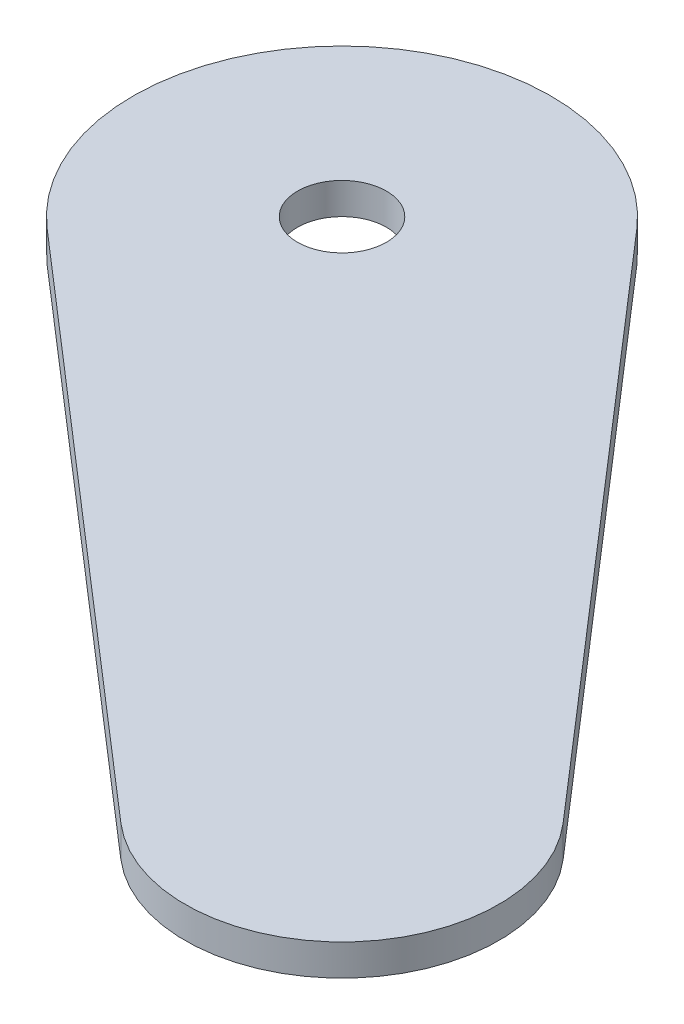
ISO-10303-21;
HEADER;
FILE_DESCRIPTION(('STEP AP214'),'2;1');
FILE_NAME('part.step','',(''),(''),'','','');
FILE_SCHEMA(('AUTOMOTIVE_DESIGN { 1 0 10303 214 1 1 1 1 }'));
ENDSEC;
DATA;
#1=APPLICATION_CONTEXT('core data for automotive mechanical design processes');
#2=APPLICATION_PROTOCOL_DEFINITION('international standard','automotive_design',2000,#1);
#3=PRODUCT_CONTEXT('',#1,'mechanical');
#4=PRODUCT('Part','Part','',(#3));
#5=PRODUCT_RELATED_PRODUCT_CATEGORY('part','',(#4));
#6=PRODUCT_DEFINITION_FORMATION('','',#4);
#7=PRODUCT_DEFINITION_CONTEXT('part definition',#1,'design');
#8=PRODUCT_DEFINITION('design','',#6,#7);
#9=PRODUCT_DEFINITION_SHAPE('','',#8);
#10=(LENGTH_UNIT() NAMED_UNIT(*) SI_UNIT(.MILLI.,.METRE.));
#11=(NAMED_UNIT(*) PLANE_ANGLE_UNIT() SI_UNIT($,.RADIAN.));
#12=(NAMED_UNIT(*) SI_UNIT($,.STERADIAN.) SOLID_ANGLE_UNIT());
#13=UNCERTAINTY_MEASURE_WITH_UNIT(LENGTH_MEASURE(1.E-05),#10,'distance_accuracy_value','');
#14=(GEOMETRIC_REPRESENTATION_CONTEXT(3) GLOBAL_UNCERTAINTY_ASSIGNED_CONTEXT((#13)) GLOBAL_UNIT_ASSIGNED_CONTEXT((#10,
#11,#12)) REPRESENTATION_CONTEXT('',''));
#15=CARTESIAN_POINT('',(0.,0.,0.));
#16=DIRECTION('',(0.,0.,1.));
#17=DIRECTION('',(1.,0.,0.));
#18=AXIS2_PLACEMENT_3D('',#15,#16,#17);
#19=CARTESIAN_POINT('',(0.,3.,0.));
#20=DIRECTION('',(0.,-1.,0.));
#21=DIRECTION('',(0.,0.,-1.));
#22=AXIS2_PLACEMENT_3D('',#19,#20,#21);
#23=CYLINDRICAL_SURFACE('',#22,20.);
#24=CARTESIAN_POINT('',(0.,0.,0.));
#25=DIRECTION('',(0.,1.,0.));
#26=DIRECTION('',(0.,0.,1.));
#27=AXIS2_PLACEMENT_3D('',#24,#25,#26);
#28=CIRCLE('',#27,20.);
#29=CARTESIAN_POINT('',(15.1161651575033,0.,-13.0958600683989));
#30=VERTEX_POINT('',#29);
#31=CARTESIAN_POINT('',(-13.0958600683989,0.,15.1161651575033));
#32=VERTEX_POINT('',#31);
#33=EDGE_CURVE('E116',#30,#32,#28,.T.);
#34=ORIENTED_EDGE('',*,*,#33,.T.);
#35=DIRECTION('',(0.,-1.,0.));
#36=VECTOR('',#35,1.);
#37=CARTESIAN_POINT('',(-13.0958600683989,3.,15.1161651575033));
#38=LINE('',#37,#36);
#39=CARTESIAN_POINT('',(-13.0958600683989,3.,15.1161651575033));
#40=VERTEX_POINT('',#39);
#41=EDGE_CURVE('E11',#40,#32,#38,.T.);
#42=ORIENTED_EDGE('',*,*,#41,.F.);
#43=CARTESIAN_POINT('',(0.,3.,0.));
#44=DIRECTION('',(0.,1.,0.));
#45=DIRECTION('',(0.,0.,1.));
#46=AXIS2_PLACEMENT_3D('',#43,#44,#45);
#47=CIRCLE('',#46,20.);
#48=CARTESIAN_POINT('',(15.1161651575033,3.,-13.0958600683989));
#49=VERTEX_POINT('',#48);
#50=EDGE_CURVE('E98',#49,#40,#47,.T.);
#51=ORIENTED_EDGE('',*,*,#50,.F.);
#52=DIRECTION('',(0.,-1.,0.));
#53=VECTOR('',#52,1.);
#54=CARTESIAN_POINT('',(15.1161651575033,3.,-13.0958600683989));
#55=LINE('',#54,#53);
#56=EDGE_CURVE('E64',#49,#30,#55,.T.);
#57=ORIENTED_EDGE('',*,*,#56,.T.);
#58=EDGE_LOOP('',(#34,#42,#51,#57));
#59=FACE_BOUND('',#58,.T.);
#60=ADVANCED_FACE('F47',(#59),#23,.T.);
#61=CARTESIAN_POINT('',(-13.0958600683989,3.,15.1161651575033));
#62=DIRECTION('',(0.654793003419943,0.,-0.755808257875164));
#63=DIRECTION('',(-0.755808257875164,0.,-0.654793003419943));
#64=AXIS2_PLACEMENT_3D('',#61,#62,#63);
#65=PLANE('',#64);
#66=DIRECTION('',(0.755808257875164,0.,0.654793003419943));
#67=VECTOR('',#66,1.);
#68=CARTESIAN_POINT('',(-13.0958600683989,0.,15.1161651575033));
#69=LINE('',#68,#67);
#70=CARTESIAN_POINT('',(39.6755796317592,0.,60.8345985511858));
#71=VERTEX_POINT('',#70);
#72=EDGE_CURVE('E104',#32,#71,#69,.T.);
#73=ORIENTED_EDGE('',*,*,#72,.T.);
#74=DIRECTION('',(0.,-1.,0.));
#75=VECTOR('',#74,1.);
#76=CARTESIAN_POINT('',(39.6755796317592,3.,60.8345985511858));
#77=LINE('',#76,#75);
#78=CARTESIAN_POINT('',(39.6755796317592,3.,60.8345985511858));
#79=VERTEX_POINT('',#78);
#80=EDGE_CURVE('E56',#79,#71,#77,.T.);
#81=ORIENTED_EDGE('',*,*,#80,.F.);
#82=DIRECTION('',(0.755808257875164,0.,0.654793003419943));
#83=VECTOR('',#82,1.);
#84=CARTESIAN_POINT('',(-13.0958600683989,3.,15.1161651575033));
#85=LINE('',#84,#83);
#86=EDGE_CURVE('E90',#40,#79,#85,.T.);
#87=ORIENTED_EDGE('',*,*,#86,.F.);
#88=ORIENTED_EDGE('',*,*,#41,.T.);
#89=EDGE_LOOP('',(#73,#81,#87,#88));
#90=FACE_BOUND('',#89,.T.);
#91=ADVANCED_FACE('F103',(#90),#65,.F.);
#92=CARTESIAN_POINT('',(49.4974746830583,3.,49.4974746830583));
#93=DIRECTION('',(0.,-1.,0.));
#94=DIRECTION('',(0.,0.,-1.));
#95=AXIS2_PLACEMENT_3D('',#92,#93,#94);
#96=CYLINDRICAL_SURFACE('',#95,15.);
#97=CARTESIAN_POINT('',(49.4974746830583,0.,49.4974746830583));
#98=DIRECTION('',(0.,1.,0.));
#99=DIRECTION('',(0.,0.,1.));
#100=AXIS2_PLACEMENT_3D('',#97,#98,#99);
#101=CIRCLE('',#100,15.);
#102=CARTESIAN_POINT('',(60.8345985511858,0.,39.6755796317592));
#103=VERTEX_POINT('',#102);
#104=EDGE_CURVE('E122',#71,#103,#101,.T.);
#105=ORIENTED_EDGE('',*,*,#104,.T.);
#106=DIRECTION('',(0.,-1.,0.));
#107=VECTOR('',#106,1.);
#108=CARTESIAN_POINT('',(60.8345985511858,3.,39.6755796317592));
#109=LINE('',#108,#107);
#110=CARTESIAN_POINT('',(60.8345985511858,3.,39.6755796317592));
#111=VERTEX_POINT('',#110);
#112=EDGE_CURVE('E79',#111,#103,#109,.T.);
#113=ORIENTED_EDGE('',*,*,#112,.F.);
#114=CARTESIAN_POINT('',(49.4974746830583,3.,49.4974746830583));
#115=DIRECTION('',(0.,1.,0.));
#116=DIRECTION('',(0.,0.,1.));
#117=AXIS2_PLACEMENT_3D('',#114,#115,#116);
#118=CIRCLE('',#117,15.);
#119=EDGE_CURVE('E97',#79,#111,#118,.T.);
#120=ORIENTED_EDGE('',*,*,#119,.F.);
#121=ORIENTED_EDGE('',*,*,#80,.T.);
#122=EDGE_LOOP('',(#105,#113,#120,#121));
#123=FACE_BOUND('',#122,.T.);
#124=ADVANCED_FACE('F108',(#123),#96,.T.);
#125=CARTESIAN_POINT('',(15.1161651575033,3.,-13.0958600683989));
#126=DIRECTION('',(0.755808257875164,0.,-0.654793003419943));
#127=DIRECTION('',(-0.654793003419943,0.,-0.755808257875164));
#128=AXIS2_PLACEMENT_3D('',#125,#126,#127);
#129=PLANE('',#128);
#130=DIRECTION('',(0.654793003419943,0.,0.755808257875164));
#131=VECTOR('',#130,1.);
#132=CARTESIAN_POINT('',(15.1161651575033,0.,-13.0958600683989));
#133=LINE('',#132,#131);
#134=EDGE_CURVE('E125',#30,#103,#133,.T.);
#135=ORIENTED_EDGE('',*,*,#134,.F.);
#136=ORIENTED_EDGE('',*,*,#56,.F.);
#137=DIRECTION('',(0.654793003419943,0.,0.755808257875164));
#138=VECTOR('',#137,1.);
#139=CARTESIAN_POINT('',(15.1161651575033,3.,-13.0958600683989));
#140=LINE('',#139,#138);
#141=EDGE_CURVE('E110',#49,#111,#140,.T.);
#142=ORIENTED_EDGE('',*,*,#141,.T.);
#143=ORIENTED_EDGE('',*,*,#112,.T.);
#144=EDGE_LOOP('',(#135,#136,#142,#143));
#145=FACE_BOUND('',#144,.T.);
#146=ADVANCED_FACE('F151',(#145),#129,.T.);
#147=CARTESIAN_POINT('',(0.,3.,0.));
#148=DIRECTION('',(0.,1.,0.));
#149=DIRECTION('',(0.,0.,1.));
#150=AXIS2_PLACEMENT_3D('',#147,#148,#149);
#151=PLANE('',#150);
#152=ORIENTED_EDGE('',*,*,#50,.T.);
#153=ORIENTED_EDGE('',*,*,#86,.T.);
#154=ORIENTED_EDGE('',*,*,#119,.T.);
#155=ORIENTED_EDGE('',*,*,#141,.F.);
#156=EDGE_LOOP('',(#152,#153,#154,#155));
#157=FACE_BOUND('',#156,.T.);
#158=CARTESIAN_POINT('',(0.,3.,0.));
#159=DIRECTION('',(0.,1.,0.));
#160=DIRECTION('',(0.,0.,1.));
#161=AXIS2_PLACEMENT_3D('',#158,#159,#160);
#162=CIRCLE('',#161,4.25);
#163=CARTESIAN_POINT('',(0.,3.,4.25));
#164=VERTEX_POINT('',#163);
#165=EDGE_CURVE('E135',#164,#164,#162,.T.);
#166=ORIENTED_EDGE('',*,*,#165,.F.);
#167=EDGE_LOOP('',(#166));
#168=FACE_BOUND('',#167,.T.);
#169=ADVANCED_FACE('F93',(#157,#168),#151,.T.);
#170=CARTESIAN_POINT('',(0.,0.,0.));
#171=DIRECTION('',(0.,1.,0.));
#172=DIRECTION('',(0.,0.,1.));
#173=AXIS2_PLACEMENT_3D('',#170,#171,#172);
#174=PLANE('',#173);
#175=ORIENTED_EDGE('',*,*,#33,.F.);
#176=ORIENTED_EDGE('',*,*,#134,.T.);
#177=ORIENTED_EDGE('',*,*,#104,.F.);
#178=ORIENTED_EDGE('',*,*,#72,.F.);
#179=EDGE_LOOP('',(#175,#176,#177,#178));
#180=FACE_BOUND('',#179,.T.);
#181=CARTESIAN_POINT('',(0.,0.,0.));
#182=DIRECTION('',(0.,1.,0.));
#183=DIRECTION('',(0.,0.,1.));
#184=AXIS2_PLACEMENT_3D('',#181,#182,#183);
#185=CIRCLE('',#184,4.25);
#186=CARTESIAN_POINT('',(0.,0.,4.25));
#187=VERTEX_POINT('',#186);
#188=EDGE_CURVE('E119',#187,#187,#185,.T.);
#189=ORIENTED_EDGE('',*,*,#188,.T.);
#190=EDGE_LOOP('',(#189));
#191=FACE_BOUND('',#190,.T.);
#192=ADVANCED_FACE('F143',(#180,#191),#174,.F.);
#193=CARTESIAN_POINT('',(0.,0.,0.));
#194=DIRECTION('',(0.,1.,0.));
#195=DIRECTION('',(0.,0.,1.));
#196=AXIS2_PLACEMENT_3D('',#193,#194,#195);
#197=CYLINDRICAL_SURFACE('',#196,4.25);
#198=ORIENTED_EDGE('',*,*,#188,.F.);
#199=EDGE_LOOP('',(#198));
#200=FACE_BOUND('',#199,.T.);
#201=ORIENTED_EDGE('',*,*,#165,.T.);
#202=EDGE_LOOP('',(#201));
#203=FACE_BOUND('',#202,.T.);
#204=ADVANCED_FACE('F145',(#200,#203),#197,.F.);
#205=CLOSED_SHELL('',(#60,#91,#124,#146,#169,#192,#204));
#206=MANIFOLD_SOLID_BREP('B2',#205);
#207=ADVANCED_BREP_SHAPE_REPRESENTATION('',(#18,#206),#14);
#208=SHAPE_DEFINITION_REPRESENTATION(#9,#207);
ENDSEC;
END-ISO-10303-21;
